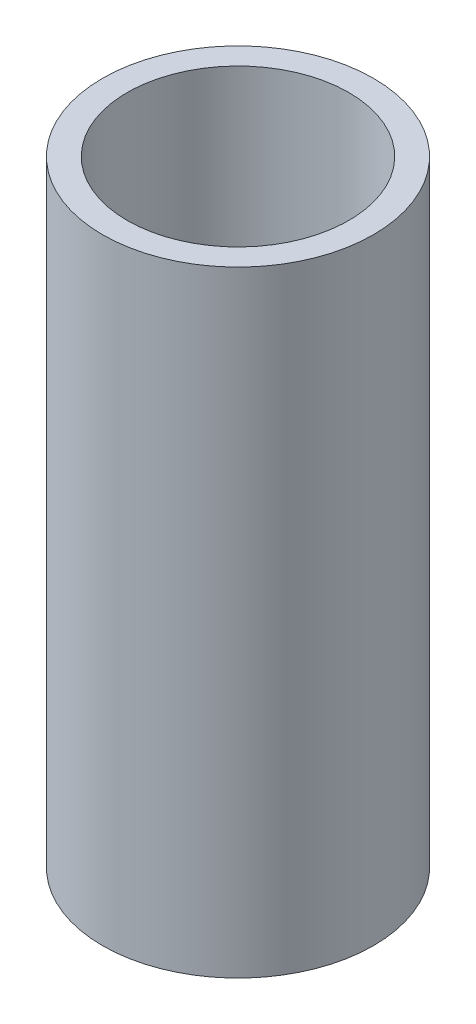
ISO-10303-21;
HEADER;
FILE_DESCRIPTION(('STEP AP214'),'2;1');
FILE_NAME('part.step','',(''),(''),'','','');
FILE_SCHEMA(('AUTOMOTIVE_DESIGN { 1 0 10303 214 1 1 1 1 }'));
ENDSEC;
DATA;
#1=APPLICATION_CONTEXT('core data for automotive mechanical design processes');
#2=APPLICATION_PROTOCOL_DEFINITION('international standard','automotive_design',2000,#1);
#3=PRODUCT_CONTEXT('',#1,'mechanical');
#4=PRODUCT('Part','Part','',(#3));
#5=PRODUCT_RELATED_PRODUCT_CATEGORY('part','',(#4));
#6=PRODUCT_DEFINITION_FORMATION('','',#4);
#7=PRODUCT_DEFINITION_CONTEXT('part definition',#1,'design');
#8=PRODUCT_DEFINITION('design','',#6,#7);
#9=PRODUCT_DEFINITION_SHAPE('','',#8);
#10=(LENGTH_UNIT() NAMED_UNIT(*) SI_UNIT(.MILLI.,.METRE.));
#11=(NAMED_UNIT(*) PLANE_ANGLE_UNIT() SI_UNIT($,.RADIAN.));
#12=(NAMED_UNIT(*) SI_UNIT($,.STERADIAN.) SOLID_ANGLE_UNIT());
#13=UNCERTAINTY_MEASURE_WITH_UNIT(LENGTH_MEASURE(1.E-05),#10,'distance_accuracy_value','');
#14=(GEOMETRIC_REPRESENTATION_CONTEXT(3) GLOBAL_UNCERTAINTY_ASSIGNED_CONTEXT((#13)) GLOBAL_UNIT_ASSIGNED_CONTEXT((#10,
#11,#12)) REPRESENTATION_CONTEXT('',''));
#15=CARTESIAN_POINT('',(0.,0.,0.));
#16=DIRECTION('',(0.,0.,1.));
#17=DIRECTION('',(1.,0.,0.));
#18=AXIS2_PLACEMENT_3D('',#15,#16,#17);
#19=CARTESIAN_POINT('',(0.,50.,0.));
#20=DIRECTION('',(0.,1.,0.));
#21=DIRECTION('',(0.,0.,1.));
#22=AXIS2_PLACEMENT_3D('',#19,#20,#21);
#23=PLANE('',#22);
#24=CARTESIAN_POINT('',(0.,50.,0.));
#25=DIRECTION('',(0.,1.,0.));
#26=DIRECTION('',(0.,0.,1.));
#27=AXIS2_PLACEMENT_3D('',#24,#25,#26);
#28=CIRCLE('',#27,11.);
#29=CARTESIAN_POINT('',(0.,50.,11.));
#30=VERTEX_POINT('',#29);
#31=EDGE_CURVE('E10',#30,#30,#28,.T.);
#32=ORIENTED_EDGE('',*,*,#31,.T.);
#33=EDGE_LOOP('',(#32));
#34=FACE_BOUND('',#33,.T.);
#35=CARTESIAN_POINT('',(0.,50.,0.));
#36=DIRECTION('',(0.,1.,0.));
#37=DIRECTION('',(0.,0.,1.));
#38=AXIS2_PLACEMENT_3D('',#35,#36,#37);
#39=CIRCLE('',#38,9.);
#40=CARTESIAN_POINT('',(0.,50.,9.));
#41=VERTEX_POINT('',#40);
#42=EDGE_CURVE('E42',#41,#41,#39,.T.);
#43=ORIENTED_EDGE('',*,*,#42,.F.);
#44=EDGE_LOOP('',(#43));
#45=FACE_BOUND('',#44,.T.);
#46=ADVANCED_FACE('F31',(#34,#45),#23,.T.);
#47=CARTESIAN_POINT('',(0.,0.,0.));
#48=DIRECTION('',(0.,1.,0.));
#49=DIRECTION('',(0.,0.,1.));
#50=AXIS2_PLACEMENT_3D('',#47,#48,#49);
#51=PLANE('',#50);
#52=CARTESIAN_POINT('',(0.,0.,0.));
#53=DIRECTION('',(0.,1.,0.));
#54=DIRECTION('',(0.,0.,1.));
#55=AXIS2_PLACEMENT_3D('',#52,#53,#54);
#56=CIRCLE('',#55,11.);
#57=CARTESIAN_POINT('',(0.,0.,11.));
#58=VERTEX_POINT('',#57);
#59=EDGE_CURVE('E35',#58,#58,#56,.T.);
#60=ORIENTED_EDGE('',*,*,#59,.F.);
#61=EDGE_LOOP('',(#60));
#62=FACE_BOUND('',#61,.T.);
#63=CARTESIAN_POINT('',(0.,0.,0.));
#64=DIRECTION('',(0.,1.,0.));
#65=DIRECTION('',(0.,0.,1.));
#66=AXIS2_PLACEMENT_3D('',#63,#64,#65);
#67=CIRCLE('',#66,9.);
#68=CARTESIAN_POINT('',(0.,0.,9.));
#69=VERTEX_POINT('',#68);
#70=EDGE_CURVE('E44',#69,#69,#67,.T.);
#71=ORIENTED_EDGE('',*,*,#70,.T.);
#72=EDGE_LOOP('',(#71));
#73=FACE_BOUND('',#72,.T.);
#74=ADVANCED_FACE('F54',(#62,#73),#51,.F.);
#75=CARTESIAN_POINT('',(0.,50.,0.));
#76=DIRECTION('',(0.,-1.,0.));
#77=DIRECTION('',(0.,0.,-1.));
#78=AXIS2_PLACEMENT_3D('',#75,#76,#77);
#79=CYLINDRICAL_SURFACE('',#78,11.);
#80=ORIENTED_EDGE('',*,*,#31,.F.);
#81=EDGE_LOOP('',(#80));
#82=FACE_BOUND('',#81,.T.);
#83=ORIENTED_EDGE('',*,*,#59,.T.);
#84=EDGE_LOOP('',(#83));
#85=FACE_BOUND('',#84,.T.);
#86=ADVANCED_FACE('F33',(#82,#85),#79,.T.);
#87=CARTESIAN_POINT('',(0.,50.,0.));
#88=DIRECTION('',(0.,-1.,0.));
#89=DIRECTION('',(0.,0.,-1.));
#90=AXIS2_PLACEMENT_3D('',#87,#88,#89);
#91=CYLINDRICAL_SURFACE('',#90,9.);
#92=ORIENTED_EDGE('',*,*,#42,.T.);
#93=EDGE_LOOP('',(#92));
#94=FACE_BOUND('',#93,.T.);
#95=ORIENTED_EDGE('',*,*,#70,.F.);
#96=EDGE_LOOP('',(#95));
#97=FACE_BOUND('',#96,.T.);
#98=ADVANCED_FACE('F50',(#94,#97),#91,.F.);
#99=CLOSED_SHELL('',(#46,#74,#86,#98));
#100=MANIFOLD_SOLID_BREP('B2',#99);
#101=ADVANCED_BREP_SHAPE_REPRESENTATION('',(#18,#100),#14);
#102=SHAPE_DEFINITION_REPRESENTATION(#9,#101);
ENDSEC;
END-ISO-10303-21;
